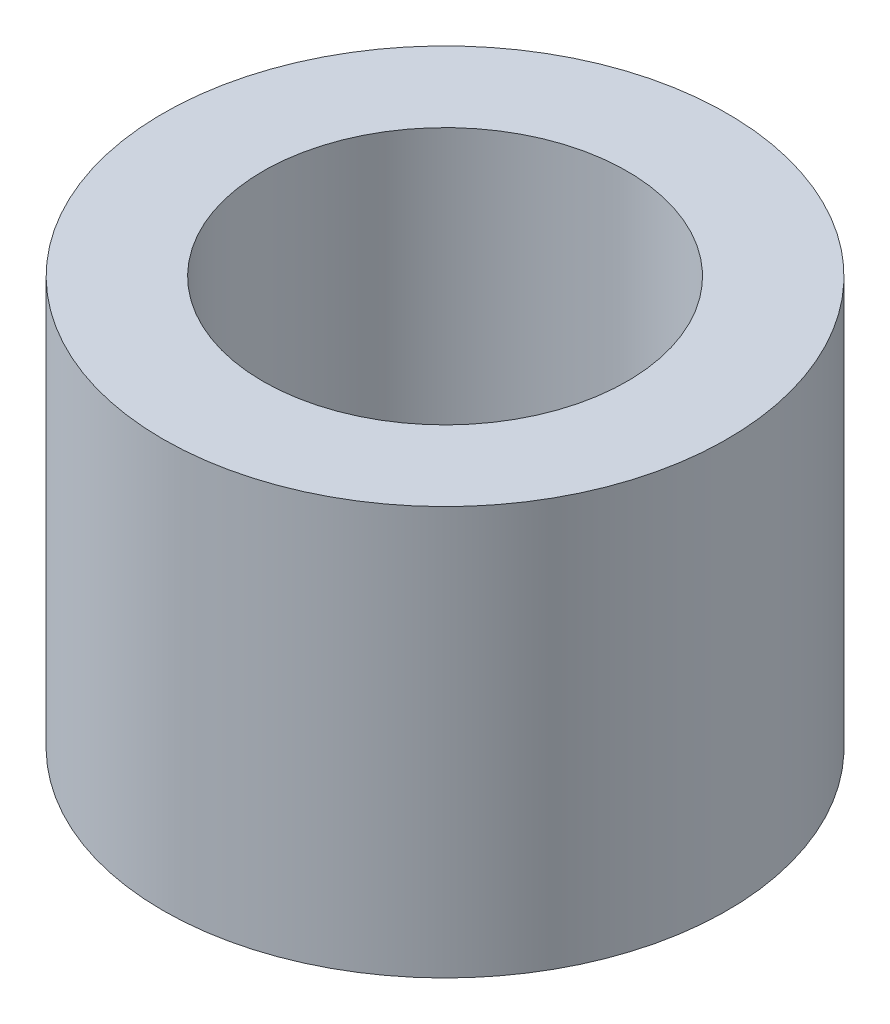
ISO-10303-21;
HEADER;
FILE_DESCRIPTION(('STEP AP214'),'2;1');
FILE_NAME('part.step','',(''),(''),'','','');
FILE_SCHEMA(('AUTOMOTIVE_DESIGN { 1 0 10303 214 1 1 1 1 }'));
ENDSEC;
DATA;
#1=APPLICATION_CONTEXT('core data for automotive mechanical design processes');
#2=APPLICATION_PROTOCOL_DEFINITION('international standard','automotive_design',2000,#1);
#3=PRODUCT_CONTEXT('',#1,'mechanical');
#4=PRODUCT('Part','Part','',(#3));
#5=PRODUCT_RELATED_PRODUCT_CATEGORY('part','',(#4));
#6=PRODUCT_DEFINITION_FORMATION('','',#4);
#7=PRODUCT_DEFINITION_CONTEXT('part definition',#1,'design');
#8=PRODUCT_DEFINITION('design','',#6,#7);
#9=PRODUCT_DEFINITION_SHAPE('','',#8);
#10=(LENGTH_UNIT() NAMED_UNIT(*) SI_UNIT(.MILLI.,.METRE.));
#11=(NAMED_UNIT(*) PLANE_ANGLE_UNIT() SI_UNIT($,.RADIAN.));
#12=(NAMED_UNIT(*) SI_UNIT($,.STERADIAN.) SOLID_ANGLE_UNIT());
#13=UNCERTAINTY_MEASURE_WITH_UNIT(LENGTH_MEASURE(1.E-05),#10,'distance_accuracy_value','');
#14=(GEOMETRIC_REPRESENTATION_CONTEXT(3) GLOBAL_UNCERTAINTY_ASSIGNED_CONTEXT((#13)) GLOBAL_UNIT_ASSIGNED_CONTEXT((#10,
#11,#12)) REPRESENTATION_CONTEXT('',''));
#15=CARTESIAN_POINT('',(0.,0.,0.));
#16=DIRECTION('',(0.,0.,1.));
#17=DIRECTION('',(1.,0.,0.));
#18=AXIS2_PLACEMENT_3D('',#15,#16,#17);
#19=CARTESIAN_POINT('',(0.,12.7,0.));
#20=DIRECTION('',(0.,1.,0.));
#21=DIRECTION('',(0.,0.,1.));
#22=AXIS2_PLACEMENT_3D('',#19,#20,#21);
#23=PLANE('',#22);
#24=CARTESIAN_POINT('',(0.,12.7,0.));
#25=DIRECTION('',(0.,1.,0.));
#26=DIRECTION('',(0.,0.,1.));
#27=AXIS2_PLACEMENT_3D('',#24,#25,#26);
#28=CIRCLE('',#27,8.7757);
#29=CARTESIAN_POINT('',(0.,12.7,8.7757));
#30=VERTEX_POINT('',#29);
#31=EDGE_CURVE('E10',#30,#30,#28,.T.);
#32=ORIENTED_EDGE('',*,*,#31,.T.);
#33=EDGE_LOOP('',(#32));
#34=FACE_BOUND('',#33,.T.);
#35=CARTESIAN_POINT('',(0.,12.7,0.));
#36=DIRECTION('',(0.,1.,0.));
#37=DIRECTION('',(0.,0.,1.));
#38=AXIS2_PLACEMENT_3D('',#35,#36,#37);
#39=CIRCLE('',#38,5.6642);
#40=CARTESIAN_POINT('',(0.,12.7,5.6642));
#41=VERTEX_POINT('',#40);
#42=EDGE_CURVE('E54',#41,#41,#39,.T.);
#43=ORIENTED_EDGE('',*,*,#42,.F.);
#44=EDGE_LOOP('',(#43));
#45=FACE_BOUND('',#44,.T.);
#46=ADVANCED_FACE('F41',(#34,#45),#23,.T.);
#47=CARTESIAN_POINT('',(0.,0.,0.));
#48=DIRECTION('',(0.,1.,0.));
#49=DIRECTION('',(0.,0.,1.));
#50=AXIS2_PLACEMENT_3D('',#47,#48,#49);
#51=PLANE('',#50);
#52=CARTESIAN_POINT('',(0.,0.,0.));
#53=DIRECTION('',(0.,1.,0.));
#54=DIRECTION('',(0.,0.,1.));
#55=AXIS2_PLACEMENT_3D('',#52,#53,#54);
#56=CIRCLE('',#55,8.7757);
#57=CARTESIAN_POINT('',(0.,0.,8.7757));
#58=VERTEX_POINT('',#57);
#59=EDGE_CURVE('E45',#58,#58,#56,.T.);
#60=ORIENTED_EDGE('',*,*,#59,.F.);
#61=EDGE_LOOP('',(#60));
#62=FACE_BOUND('',#61,.T.);
#63=CARTESIAN_POINT('',(0.,0.,0.));
#64=DIRECTION('',(0.,1.,0.));
#65=DIRECTION('',(0.,0.,1.));
#66=AXIS2_PLACEMENT_3D('',#63,#64,#65);
#67=CIRCLE('',#66,5.6642);
#68=CARTESIAN_POINT('',(0.,0.,5.6642));
#69=VERTEX_POINT('',#68);
#70=EDGE_CURVE('E56',#69,#69,#67,.T.);
#71=ORIENTED_EDGE('',*,*,#70,.T.);
#72=EDGE_LOOP('',(#71));
#73=FACE_BOUND('',#72,.T.);
#74=ADVANCED_FACE('F68',(#62,#73),#51,.F.);
#75=CARTESIAN_POINT('',(0.,12.7,0.));
#76=DIRECTION('',(0.,-1.,0.));
#77=DIRECTION('',(0.,0.,-1.));
#78=AXIS2_PLACEMENT_3D('',#75,#76,#77);
#79=CYLINDRICAL_SURFACE('',#78,8.7757);
#80=ORIENTED_EDGE('',*,*,#31,.F.);
#81=EDGE_LOOP('',(#80));
#82=FACE_BOUND('',#81,.T.);
#83=ORIENTED_EDGE('',*,*,#59,.T.);
#84=EDGE_LOOP('',(#83));
#85=FACE_BOUND('',#84,.T.);
#86=ADVANCED_FACE('F43',(#82,#85),#79,.T.);
#87=CARTESIAN_POINT('',(0.,12.7,0.));
#88=DIRECTION('',(0.,-1.,0.));
#89=DIRECTION('',(0.,0.,-1.));
#90=AXIS2_PLACEMENT_3D('',#87,#88,#89);
#91=CYLINDRICAL_SURFACE('',#90,5.6642);
#92=ORIENTED_EDGE('',*,*,#42,.T.);
#93=EDGE_LOOP('',(#92));
#94=FACE_BOUND('',#93,.T.);
#95=ORIENTED_EDGE('',*,*,#70,.F.);
#96=EDGE_LOOP('',(#95));
#97=FACE_BOUND('',#96,.T.);
#98=ADVANCED_FACE('F64',(#94,#97),#91,.F.);
#99=CLOSED_SHELL('',(#46,#74,#86,#98));
#100=MANIFOLD_SOLID_BREP('B2',#99);
#101=ADVANCED_BREP_SHAPE_REPRESENTATION('',(#18,#100),#14);
#102=SHAPE_DEFINITION_REPRESENTATION(#9,#101);
ENDSEC;
END-ISO-10303-21;
